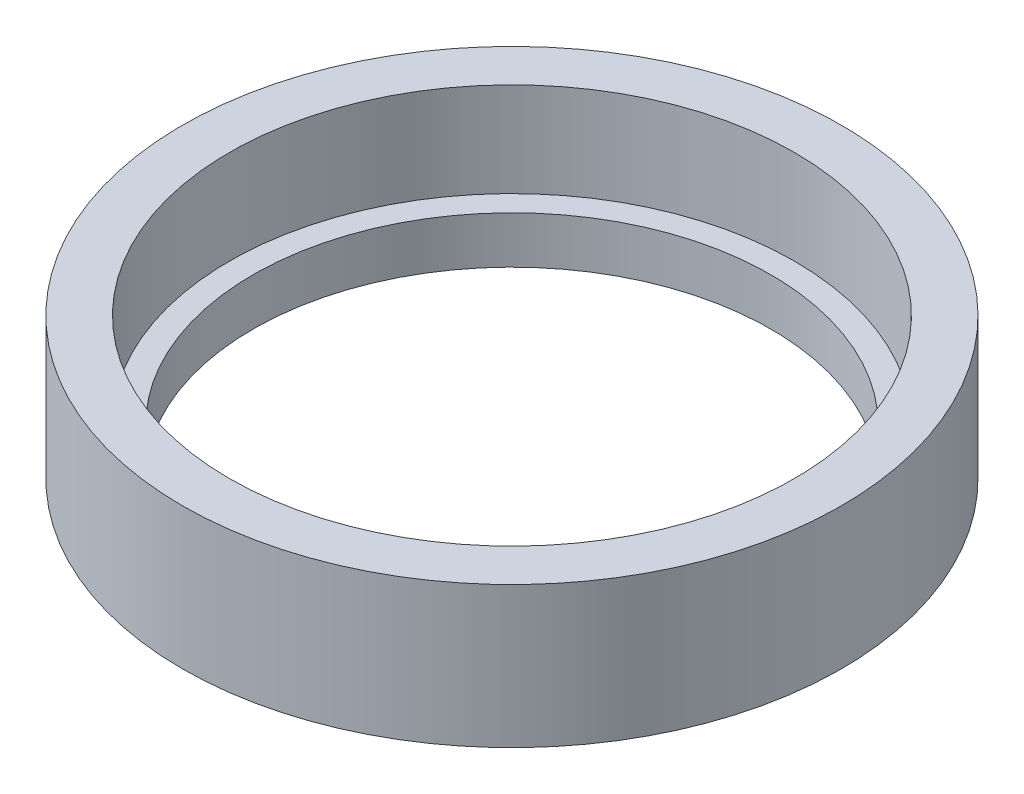
ISO-10303-21;
HEADER;
FILE_DESCRIPTION(('STEP AP214'),'2;1');
FILE_NAME('part.step','',(''),(''),'','','');
FILE_SCHEMA(('AUTOMOTIVE_DESIGN { 1 0 10303 214 1 1 1 1 }'));
ENDSEC;
DATA;
#1=APPLICATION_CONTEXT('core data for automotive mechanical design processes');
#2=APPLICATION_PROTOCOL_DEFINITION('international standard','automotive_design',2000,#1);
#3=PRODUCT_CONTEXT('',#1,'mechanical');
#4=PRODUCT('Part','Part','',(#3));
#5=PRODUCT_RELATED_PRODUCT_CATEGORY('part','',(#4));
#6=PRODUCT_DEFINITION_FORMATION('','',#4);
#7=PRODUCT_DEFINITION_CONTEXT('part definition',#1,'design');
#8=PRODUCT_DEFINITION('design','',#6,#7);
#9=PRODUCT_DEFINITION_SHAPE('','',#8);
#10=(LENGTH_UNIT() NAMED_UNIT(*) SI_UNIT(.MILLI.,.METRE.));
#11=(NAMED_UNIT(*) PLANE_ANGLE_UNIT() SI_UNIT($,.RADIAN.));
#12=(NAMED_UNIT(*) SI_UNIT($,.STERADIAN.) SOLID_ANGLE_UNIT());
#13=UNCERTAINTY_MEASURE_WITH_UNIT(LENGTH_MEASURE(1.E-05),#10,'distance_accuracy_value','');
#14=(GEOMETRIC_REPRESENTATION_CONTEXT(3) GLOBAL_UNCERTAINTY_ASSIGNED_CONTEXT((#13)) GLOBAL_UNIT_ASSIGNED_CONTEXT((#10,
#11,#12)) REPRESENTATION_CONTEXT('',''));
#15=CARTESIAN_POINT('',(0.,0.,0.));
#16=DIRECTION('',(0.,0.,1.));
#17=DIRECTION('',(1.,0.,0.));
#18=AXIS2_PLACEMENT_3D('',#15,#16,#17);
#19=CARTESIAN_POINT('',(0.,15.,0.));
#20=DIRECTION('',(0.,-1.,0.));
#21=DIRECTION('',(0.,0.,-1.));
#22=AXIS2_PLACEMENT_3D('',#19,#20,#21);
#23=CYLINDRICAL_SURFACE('',#22,27.5);
#24=CARTESIAN_POINT('',(0.,0.,0.));
#25=DIRECTION('',(0.,1.,0.));
#26=DIRECTION('',(0.,0.,1.));
#27=AXIS2_PLACEMENT_3D('',#24,#25,#26);
#28=CIRCLE('',#27,27.5);
#29=CARTESIAN_POINT('',(0.,0.,27.5));
#30=VERTEX_POINT('',#29);
#31=EDGE_CURVE('E46',#30,#30,#28,.T.);
#32=ORIENTED_EDGE('',*,*,#31,.F.);
#33=EDGE_LOOP('',(#32));
#34=FACE_BOUND('',#33,.T.);
#35=CARTESIAN_POINT('',(0.,5.,0.));
#36=DIRECTION('',(0.,1.,0.));
#37=DIRECTION('',(0.,0.,1.));
#38=AXIS2_PLACEMENT_3D('',#35,#36,#37);
#39=CIRCLE('',#38,27.5);
#40=CARTESIAN_POINT('',(0.,5.,27.5));
#41=VERTEX_POINT('',#40);
#42=EDGE_CURVE('E37',#41,#41,#39,.T.);
#43=ORIENTED_EDGE('',*,*,#42,.T.);
#44=EDGE_LOOP('',(#43));
#45=FACE_BOUND('',#44,.T.);
#46=ADVANCED_FACE('F33',(#34,#45),#23,.F.);
#47=CARTESIAN_POINT('',(0.,15.,0.));
#48=DIRECTION('',(0.,1.,0.));
#49=DIRECTION('',(0.,0.,1.));
#50=AXIS2_PLACEMENT_3D('',#47,#48,#49);
#51=PLANE('',#50);
#52=CARTESIAN_POINT('',(0.,15.,0.));
#53=DIRECTION('',(0.,1.,0.));
#54=DIRECTION('',(0.,0.,1.));
#55=AXIS2_PLACEMENT_3D('',#52,#53,#54);
#56=CIRCLE('',#55,30.);
#57=CARTESIAN_POINT('',(0.,15.,30.));
#58=VERTEX_POINT('',#57);
#59=EDGE_CURVE('E50',#58,#58,#56,.T.);
#60=ORIENTED_EDGE('',*,*,#59,.F.);
#61=EDGE_LOOP('',(#60));
#62=FACE_BOUND('',#61,.T.);
#63=CARTESIAN_POINT('',(0.,15.,0.));
#64=DIRECTION('',(0.,1.,0.));
#65=DIRECTION('',(0.,0.,1.));
#66=AXIS2_PLACEMENT_3D('',#63,#64,#65);
#67=CIRCLE('',#66,35.);
#68=CARTESIAN_POINT('',(0.,15.,35.));
#69=VERTEX_POINT('',#68);
#70=EDGE_CURVE('E10',#69,#69,#67,.T.);
#71=ORIENTED_EDGE('',*,*,#70,.T.);
#72=EDGE_LOOP('',(#71));
#73=FACE_BOUND('',#72,.T.);
#74=ADVANCED_FACE('F71',(#62,#73),#51,.T.);
#75=CARTESIAN_POINT('',(0.,0.,0.));
#76=DIRECTION('',(0.,1.,0.));
#77=DIRECTION('',(0.,0.,1.));
#78=AXIS2_PLACEMENT_3D('',#75,#76,#77);
#79=PLANE('',#78);
#80=CARTESIAN_POINT('',(0.,0.,0.));
#81=DIRECTION('',(0.,1.,0.));
#82=DIRECTION('',(0.,0.,1.));
#83=AXIS2_PLACEMENT_3D('',#80,#81,#82);
#84=CIRCLE('',#83,35.);
#85=CARTESIAN_POINT('',(0.,0.,35.));
#86=VERTEX_POINT('',#85);
#87=EDGE_CURVE('E41',#86,#86,#84,.T.);
#88=ORIENTED_EDGE('',*,*,#87,.F.);
#89=EDGE_LOOP('',(#88));
#90=FACE_BOUND('',#89,.T.);
#91=ORIENTED_EDGE('',*,*,#31,.T.);
#92=EDGE_LOOP('',(#91));
#93=FACE_BOUND('',#92,.T.);
#94=ADVANCED_FACE('F77',(#90,#93),#79,.F.);
#95=CARTESIAN_POINT('',(0.,15.,0.));
#96=DIRECTION('',(0.,-1.,0.));
#97=DIRECTION('',(0.,0.,-1.));
#98=AXIS2_PLACEMENT_3D('',#95,#96,#97);
#99=CYLINDRICAL_SURFACE('',#98,35.);
#100=ORIENTED_EDGE('',*,*,#70,.F.);
#101=EDGE_LOOP('',(#100));
#102=FACE_BOUND('',#101,.T.);
#103=ORIENTED_EDGE('',*,*,#87,.T.);
#104=EDGE_LOOP('',(#103));
#105=FACE_BOUND('',#104,.T.);
#106=ADVANCED_FACE('F35',(#102,#105),#99,.T.);
#107=CARTESIAN_POINT('',(0.,5.,0.));
#108=DIRECTION('',(0.,1.,0.));
#109=DIRECTION('',(0.,0.,1.));
#110=AXIS2_PLACEMENT_3D('',#107,#108,#109);
#111=CYLINDRICAL_SURFACE('',#110,30.);
#112=CARTESIAN_POINT('',(0.,5.,0.));
#113=DIRECTION('',(0.,1.,0.));
#114=DIRECTION('',(0.,0.,1.));
#115=AXIS2_PLACEMENT_3D('',#112,#113,#114);
#116=CIRCLE('',#115,30.);
#117=CARTESIAN_POINT('',(0.,5.,30.));
#118=VERTEX_POINT('',#117);
#119=EDGE_CURVE('E53',#118,#118,#116,.T.);
#120=ORIENTED_EDGE('',*,*,#119,.F.);
#121=EDGE_LOOP('',(#120));
#122=FACE_BOUND('',#121,.T.);
#123=ORIENTED_EDGE('',*,*,#59,.T.);
#124=EDGE_LOOP('',(#123));
#125=FACE_BOUND('',#124,.T.);
#126=ADVANCED_FACE('F63',(#122,#125),#111,.F.);
#127=CARTESIAN_POINT('',(0.,5.,0.));
#128=DIRECTION('',(0.,1.,0.));
#129=DIRECTION('',(0.,0.,1.));
#130=AXIS2_PLACEMENT_3D('',#127,#128,#129);
#131=PLANE('',#130);
#132=ORIENTED_EDGE('',*,*,#42,.F.);
#133=EDGE_LOOP('',(#132));
#134=FACE_BOUND('',#133,.T.);
#135=ORIENTED_EDGE('',*,*,#119,.T.);
#136=EDGE_LOOP('',(#135));
#137=FACE_BOUND('',#136,.T.);
#138=ADVANCED_FACE('F61',(#134,#137),#131,.T.);
#139=CLOSED_SHELL('',(#46,#74,#94,#106,#126,#138));
#140=MANIFOLD_SOLID_BREP('B2',#139);
#141=ADVANCED_BREP_SHAPE_REPRESENTATION('',(#18,#140),#14);
#142=SHAPE_DEFINITION_REPRESENTATION(#9,#141);
ENDSEC;
END-ISO-10303-21;
